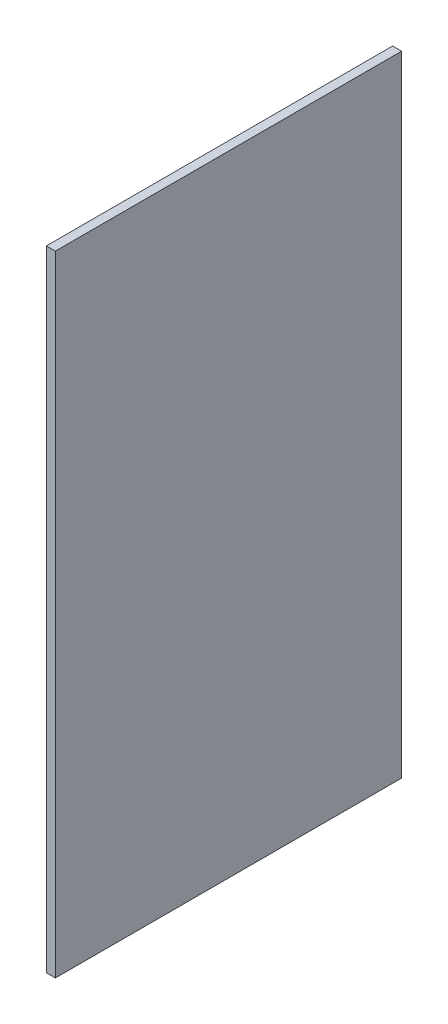
ISO-10303-21;
HEADER;
FILE_DESCRIPTION(('STEP AP214'),'2;1');
FILE_NAME('part.step','',(''),(''),'','','');
FILE_SCHEMA(('AUTOMOTIVE_DESIGN { 1 0 10303 214 1 1 1 1 }'));
ENDSEC;
DATA;
#1=APPLICATION_CONTEXT('core data for automotive mechanical design processes');
#2=APPLICATION_PROTOCOL_DEFINITION('international standard','automotive_design',2000,#1);
#3=PRODUCT_CONTEXT('',#1,'mechanical');
#4=PRODUCT('Part','Part','',(#3));
#5=PRODUCT_RELATED_PRODUCT_CATEGORY('part','',(#4));
#6=PRODUCT_DEFINITION_FORMATION('','',#4);
#7=PRODUCT_DEFINITION_CONTEXT('part definition',#1,'design');
#8=PRODUCT_DEFINITION('design','',#6,#7);
#9=PRODUCT_DEFINITION_SHAPE('','',#8);
#10=(LENGTH_UNIT() NAMED_UNIT(*) SI_UNIT(.MILLI.,.METRE.));
#11=(NAMED_UNIT(*) PLANE_ANGLE_UNIT() SI_UNIT($,.RADIAN.));
#12=(NAMED_UNIT(*) SI_UNIT($,.STERADIAN.) SOLID_ANGLE_UNIT());
#13=UNCERTAINTY_MEASURE_WITH_UNIT(LENGTH_MEASURE(1.E-05),#10,'distance_accuracy_value','');
#14=(GEOMETRIC_REPRESENTATION_CONTEXT(3) GLOBAL_UNCERTAINTY_ASSIGNED_CONTEXT((#13)) GLOBAL_UNIT_ASSIGNED_CONTEXT((#10,
#11,#12)) REPRESENTATION_CONTEXT('',''));
#15=CARTESIAN_POINT('',(0.,0.,0.));
#16=DIRECTION('',(0.,0.,1.));
#17=DIRECTION('',(1.,0.,0.));
#18=AXIS2_PLACEMENT_3D('',#15,#16,#17);
#19=CARTESIAN_POINT('',(4.,0.,0.));
#20=DIRECTION('',(0.,0.,-1.));
#21=DIRECTION('',(-1.,0.,0.));
#22=AXIS2_PLACEMENT_3D('',#19,#20,#21);
#23=PLANE('',#22);
#24=DIRECTION('',(0.,-1.,0.));
#25=VECTOR('',#24,1.);
#26=CARTESIAN_POINT('',(0.,0.,0.));
#27=LINE('',#26,#25);
#28=CARTESIAN_POINT('',(0.,280.,0.));
#29=VERTEX_POINT('',#28);
#30=CARTESIAN_POINT('',(0.,0.,0.));
#31=VERTEX_POINT('',#30);
#32=EDGE_CURVE('E117',#29,#31,#27,.T.);
#33=ORIENTED_EDGE('',*,*,#32,.T.);
#34=DIRECTION('',(-1.,0.,0.));
#35=VECTOR('',#34,1.);
#36=CARTESIAN_POINT('',(4.,0.,0.));
#37=LINE('',#36,#35);
#38=CARTESIAN_POINT('',(4.,0.,0.));
#39=VERTEX_POINT('',#38);
#40=EDGE_CURVE('E11',#39,#31,#37,.T.);
#41=ORIENTED_EDGE('',*,*,#40,.F.);
#42=DIRECTION('',(0.,-1.,0.));
#43=VECTOR('',#42,1.);
#44=CARTESIAN_POINT('',(4.,0.,0.));
#45=LINE('',#44,#43);
#46=CARTESIAN_POINT('',(4.,280.,0.));
#47=VERTEX_POINT('',#46);
#48=EDGE_CURVE('E101',#47,#39,#45,.T.);
#49=ORIENTED_EDGE('',*,*,#48,.F.);
#50=DIRECTION('',(-1.,0.,0.));
#51=VECTOR('',#50,1.);
#52=CARTESIAN_POINT('',(4.,280.,0.));
#53=LINE('',#52,#51);
#54=EDGE_CURVE('E113',#47,#29,#53,.T.);
#55=ORIENTED_EDGE('',*,*,#54,.T.);
#56=EDGE_LOOP('',(#33,#41,#49,#55));
#57=FACE_BOUND('',#56,.T.);
#58=ADVANCED_FACE('F49',(#57),#23,.F.);
#59=CARTESIAN_POINT('',(4.,0.,0.));
#60=DIRECTION('',(0.,1.,0.));
#61=DIRECTION('',(0.,0.,1.));
#62=AXIS2_PLACEMENT_3D('',#59,#60,#61);
#63=PLANE('',#62);
#64=DIRECTION('',(0.,0.,-1.));
#65=VECTOR('',#64,1.);
#66=CARTESIAN_POINT('',(0.,0.,0.));
#67=LINE('',#66,#65);
#68=CARTESIAN_POINT('',(0.,0.,-154.));
#69=VERTEX_POINT('',#68);
#70=EDGE_CURVE('E106',#31,#69,#67,.T.);
#71=ORIENTED_EDGE('',*,*,#70,.T.);
#72=DIRECTION('',(-1.,0.,0.));
#73=VECTOR('',#72,1.);
#74=CARTESIAN_POINT('',(4.,0.,-154.));
#75=LINE('',#74,#73);
#76=CARTESIAN_POINT('',(4.,0.,-154.));
#77=VERTEX_POINT('',#76);
#78=EDGE_CURVE('E58',#77,#69,#75,.T.);
#79=ORIENTED_EDGE('',*,*,#78,.F.);
#80=DIRECTION('',(0.,0.,-1.));
#81=VECTOR('',#80,1.);
#82=CARTESIAN_POINT('',(4.,0.,0.));
#83=LINE('',#82,#81);
#84=EDGE_CURVE('E96',#39,#77,#83,.T.);
#85=ORIENTED_EDGE('',*,*,#84,.F.);
#86=ORIENTED_EDGE('',*,*,#40,.T.);
#87=EDGE_LOOP('',(#71,#79,#85,#86));
#88=FACE_BOUND('',#87,.T.);
#89=ADVANCED_FACE('F105',(#88),#63,.F.);
#90=CARTESIAN_POINT('',(4.,0.,-154.));
#91=DIRECTION('',(0.,0.,1.));
#92=DIRECTION('',(1.,0.,0.));
#93=AXIS2_PLACEMENT_3D('',#90,#91,#92);
#94=PLANE('',#93);
#95=DIRECTION('',(0.,1.,0.));
#96=VECTOR('',#95,1.);
#97=CARTESIAN_POINT('',(0.,0.,-154.));
#98=LINE('',#97,#96);
#99=CARTESIAN_POINT('',(0.,280.,-154.));
#100=VERTEX_POINT('',#99);
#101=EDGE_CURVE('E83',#69,#100,#98,.T.);
#102=ORIENTED_EDGE('',*,*,#101,.T.);
#103=DIRECTION('',(-1.,0.,0.));
#104=VECTOR('',#103,1.);
#105=CARTESIAN_POINT('',(4.,280.,-154.));
#106=LINE('',#105,#104);
#107=CARTESIAN_POINT('',(4.,280.,-154.));
#108=VERTEX_POINT('',#107);
#109=EDGE_CURVE('E108',#108,#100,#106,.T.);
#110=ORIENTED_EDGE('',*,*,#109,.F.);
#111=DIRECTION('',(0.,1.,0.));
#112=VECTOR('',#111,1.);
#113=CARTESIAN_POINT('',(4.,0.,-154.));
#114=LINE('',#113,#112);
#115=EDGE_CURVE('E99',#77,#108,#114,.T.);
#116=ORIENTED_EDGE('',*,*,#115,.F.);
#117=ORIENTED_EDGE('',*,*,#78,.T.);
#118=EDGE_LOOP('',(#102,#110,#116,#117));
#119=FACE_BOUND('',#118,.T.);
#120=ADVANCED_FACE('F109',(#119),#94,.F.);
#121=CARTESIAN_POINT('',(4.,280.,0.));
#122=DIRECTION('',(0.,-1.,0.));
#123=DIRECTION('',(0.,0.,-1.));
#124=AXIS2_PLACEMENT_3D('',#121,#122,#123);
#125=PLANE('',#124);
#126=DIRECTION('',(0.,0.,1.));
#127=VECTOR('',#126,1.);
#128=CARTESIAN_POINT('',(0.,280.,0.));
#129=LINE('',#128,#127);
#130=EDGE_CURVE('E89',#100,#29,#129,.T.);
#131=ORIENTED_EDGE('',*,*,#130,.T.);
#132=ORIENTED_EDGE('',*,*,#54,.F.);
#133=DIRECTION('',(0.,0.,1.));
#134=VECTOR('',#133,1.);
#135=CARTESIAN_POINT('',(4.,280.,0.));
#136=LINE('',#135,#134);
#137=EDGE_CURVE('E66',#108,#47,#136,.T.);
#138=ORIENTED_EDGE('',*,*,#137,.F.);
#139=ORIENTED_EDGE('',*,*,#109,.T.);
#140=EDGE_LOOP('',(#131,#132,#138,#139));
#141=FACE_BOUND('',#140,.T.);
#142=ADVANCED_FACE('F130',(#141),#125,.F.);
#143=CARTESIAN_POINT('',(4.,0.,0.));
#144=DIRECTION('',(-1.,0.,0.));
#145=DIRECTION('',(0.,0.,1.));
#146=AXIS2_PLACEMENT_3D('',#143,#144,#145);
#147=PLANE('',#146);
#148=ORIENTED_EDGE('',*,*,#48,.T.);
#149=ORIENTED_EDGE('',*,*,#84,.T.);
#150=ORIENTED_EDGE('',*,*,#115,.T.);
#151=ORIENTED_EDGE('',*,*,#137,.T.);
#152=EDGE_LOOP('',(#148,#149,#150,#151));
#153=FACE_BOUND('',#152,.T.);
#154=ADVANCED_FACE('F97',(#153),#147,.F.);
#155=CARTESIAN_POINT('',(0.,0.,0.));
#156=DIRECTION('',(-1.,0.,0.));
#157=DIRECTION('',(0.,0.,1.));
#158=AXIS2_PLACEMENT_3D('',#155,#156,#157);
#159=PLANE('',#158);
#160=ORIENTED_EDGE('',*,*,#32,.F.);
#161=ORIENTED_EDGE('',*,*,#130,.F.);
#162=ORIENTED_EDGE('',*,*,#101,.F.);
#163=ORIENTED_EDGE('',*,*,#70,.F.);
#164=EDGE_LOOP('',(#160,#161,#162,#163));
#165=FACE_BOUND('',#164,.T.);
#166=ADVANCED_FACE('F133',(#165),#159,.T.);
#167=CLOSED_SHELL('',(#58,#89,#120,#142,#154,#166));
#168=MANIFOLD_SOLID_BREP('B2',#167);
#169=ADVANCED_BREP_SHAPE_REPRESENTATION('',(#18,#168),#14);
#170=SHAPE_DEFINITION_REPRESENTATION(#9,#169);
ENDSEC;
END-ISO-10303-21;
